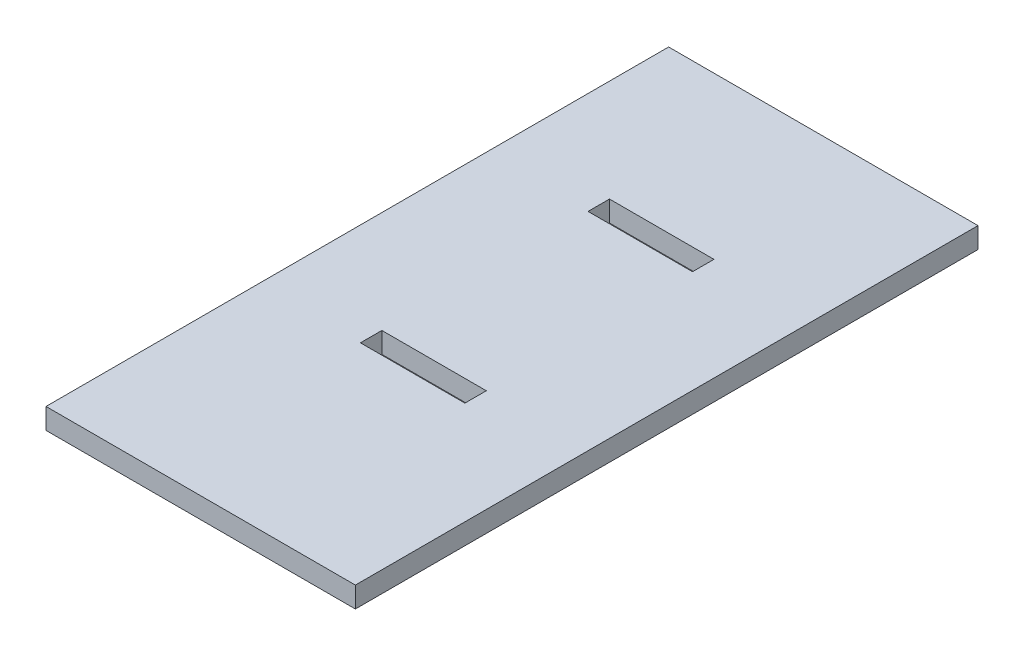
ISO-10303-21;
HEADER;
FILE_DESCRIPTION(('STEP AP214'),'2;1');
FILE_NAME('part.step','',(''),(''),'','','');
FILE_SCHEMA(('AUTOMOTIVE_DESIGN { 1 0 10303 214 1 1 1 1 }'));
ENDSEC;
DATA;
#1=APPLICATION_CONTEXT('core data for automotive mechanical design processes');
#2=APPLICATION_PROTOCOL_DEFINITION('international standard','automotive_design',2000,#1);
#3=PRODUCT_CONTEXT('',#1,'mechanical');
#4=PRODUCT('Part','Part','',(#3));
#5=PRODUCT_RELATED_PRODUCT_CATEGORY('part','',(#4));
#6=PRODUCT_DEFINITION_FORMATION('','',#4);
#7=PRODUCT_DEFINITION_CONTEXT('part definition',#1,'design');
#8=PRODUCT_DEFINITION('design','',#6,#7);
#9=PRODUCT_DEFINITION_SHAPE('','',#8);
#10=(LENGTH_UNIT() NAMED_UNIT(*) SI_UNIT(.MILLI.,.METRE.));
#11=(NAMED_UNIT(*) PLANE_ANGLE_UNIT() SI_UNIT($,.RADIAN.));
#12=(NAMED_UNIT(*) SI_UNIT($,.STERADIAN.) SOLID_ANGLE_UNIT());
#13=UNCERTAINTY_MEASURE_WITH_UNIT(LENGTH_MEASURE(1.E-05),#10,'distance_accuracy_value','');
#14=(GEOMETRIC_REPRESENTATION_CONTEXT(3) GLOBAL_UNCERTAINTY_ASSIGNED_CONTEXT((#13)) GLOBAL_UNIT_ASSIGNED_CONTEXT((#10,
#11,#12)) REPRESENTATION_CONTEXT('',''));
#15=CARTESIAN_POINT('',(0.,0.,0.));
#16=DIRECTION('',(0.,0.,1.));
#17=DIRECTION('',(1.,0.,0.));
#18=AXIS2_PLACEMENT_3D('',#15,#16,#17);
#19=CARTESIAN_POINT('',(0.,3.,0.));
#20=DIRECTION('',(0.,-1.,0.));
#21=DIRECTION('',(0.,0.,-1.));
#22=AXIS2_PLACEMENT_3D('',#19,#20,#21);
#23=PLANE('',#22);
#24=DIRECTION('',(0.,0.,1.));
#25=VECTOR('',#24,1.);
#26=CARTESIAN_POINT('',(14.76,3.,-33.79));
#27=LINE('',#26,#25);
#28=CARTESIAN_POINT('',(14.76,3.,-33.79));
#29=VERTEX_POINT('',#28);
#30=CARTESIAN_POINT('',(14.76,3.,-30.69));
#31=VERTEX_POINT('',#30);
#32=EDGE_CURVE('E164',#29,#31,#27,.T.);
#33=ORIENTED_EDGE('',*,*,#32,.F.);
#34=DIRECTION('',(-1.,0.,0.));
#35=VECTOR('',#34,1.);
#36=CARTESIAN_POINT('',(14.76,3.,-33.79));
#37=LINE('',#36,#35);
#38=CARTESIAN_POINT('',(29.86,3.,-33.79));
#39=VERTEX_POINT('',#38);
#40=EDGE_CURVE('E172',#39,#29,#37,.T.);
#41=ORIENTED_EDGE('',*,*,#40,.F.);
#42=DIRECTION('',(0.,0.,-1.));
#43=VECTOR('',#42,1.);
#44=CARTESIAN_POINT('',(29.86,3.,-33.79));
#45=LINE('',#44,#43);
#46=CARTESIAN_POINT('',(29.86,3.,-30.69));
#47=VERTEX_POINT('',#46);
#48=EDGE_CURVE('E169',#47,#39,#45,.T.);
#49=ORIENTED_EDGE('',*,*,#48,.F.);
#50=DIRECTION('',(1.,0.,0.));
#51=VECTOR('',#50,1.);
#52=CARTESIAN_POINT('',(14.76,3.,-30.69));
#53=LINE('',#52,#51);
#54=EDGE_CURVE('E166',#31,#47,#53,.T.);
#55=ORIENTED_EDGE('',*,*,#54,.F.);
#56=EDGE_LOOP('',(#33,#41,#49,#55));
#57=FACE_BOUND('',#56,.T.);
#58=DIRECTION('',(0.,0.,1.));
#59=VECTOR('',#58,1.);
#60=CARTESIAN_POINT('',(0.,3.,0.));
#61=LINE('',#60,#59);
#62=CARTESIAN_POINT('',(0.,3.,-90.));
#63=VERTEX_POINT('',#62);
#64=CARTESIAN_POINT('',(0.,3.,0.));
#65=VERTEX_POINT('',#64);
#66=EDGE_CURVE('E195',#63,#65,#61,.T.);
#67=ORIENTED_EDGE('',*,*,#66,.T.);
#68=DIRECTION('',(1.,0.,0.));
#69=VECTOR('',#68,1.);
#70=CARTESIAN_POINT('',(0.,3.,0.));
#71=LINE('',#70,#69);
#72=CARTESIAN_POINT('',(44.72,3.,0.));
#73=VERTEX_POINT('',#72);
#74=EDGE_CURVE('E198',#65,#73,#71,.T.);
#75=ORIENTED_EDGE('',*,*,#74,.T.);
#76=DIRECTION('',(0.,0.,-1.));
#77=VECTOR('',#76,1.);
#78=CARTESIAN_POINT('',(44.72,3.,0.));
#79=LINE('',#78,#77);
#80=CARTESIAN_POINT('',(44.72,3.,-90.));
#81=VERTEX_POINT('',#80);
#82=EDGE_CURVE('E201',#73,#81,#79,.T.);
#83=ORIENTED_EDGE('',*,*,#82,.T.);
#84=DIRECTION('',(-1.,0.,0.));
#85=VECTOR('',#84,1.);
#86=CARTESIAN_POINT('',(0.,3.,-90.));
#87=LINE('',#86,#85);
#88=EDGE_CURVE('E203',#81,#63,#87,.T.);
#89=ORIENTED_EDGE('',*,*,#88,.T.);
#90=EDGE_LOOP('',(#67,#75,#83,#89));
#91=FACE_BOUND('',#90,.T.);
#92=DIRECTION('',(0.,0.,1.));
#93=VECTOR('',#92,1.);
#94=CARTESIAN_POINT('',(14.76,3.,-66.69));
#95=LINE('',#94,#93);
#96=CARTESIAN_POINT('',(14.76,3.,-66.69));
#97=VERTEX_POINT('',#96);
#98=CARTESIAN_POINT('',(14.76,3.,-63.59));
#99=VERTEX_POINT('',#98);
#100=EDGE_CURVE('E128',#97,#99,#95,.T.);
#101=ORIENTED_EDGE('',*,*,#100,.F.);
#102=DIRECTION('',(-1.,0.,0.));
#103=VECTOR('',#102,1.);
#104=CARTESIAN_POINT('',(14.76,3.,-66.69));
#105=LINE('',#104,#103);
#106=CARTESIAN_POINT('',(29.86,3.,-66.69));
#107=VERTEX_POINT('',#106);
#108=EDGE_CURVE('E150',#107,#97,#105,.T.);
#109=ORIENTED_EDGE('',*,*,#108,.F.);
#110=DIRECTION('',(0.,0.,-1.));
#111=VECTOR('',#110,1.);
#112=CARTESIAN_POINT('',(29.86,3.,-66.69));
#113=LINE('',#112,#111);
#114=CARTESIAN_POINT('',(29.86,3.,-63.59));
#115=VERTEX_POINT('',#114);
#116=EDGE_CURVE('E148',#115,#107,#113,.T.);
#117=ORIENTED_EDGE('',*,*,#116,.F.);
#118=DIRECTION('',(1.,0.,0.));
#119=VECTOR('',#118,1.);
#120=CARTESIAN_POINT('',(14.76,3.,-63.59));
#121=LINE('',#120,#119);
#122=EDGE_CURVE('E136',#99,#115,#121,.T.);
#123=ORIENTED_EDGE('',*,*,#122,.F.);
#124=EDGE_LOOP('',(#101,#109,#117,#123));
#125=FACE_BOUND('',#124,.T.);
#126=ADVANCED_FACE('F39',(#57,#91,#125),#23,.F.);
#127=CARTESIAN_POINT('',(0.,0.,0.));
#128=DIRECTION('',(0.,-1.,0.));
#129=DIRECTION('',(0.,0.,-1.));
#130=AXIS2_PLACEMENT_3D('',#127,#128,#129);
#131=PLANE('',#130);
#132=DIRECTION('',(0.,0.,1.));
#133=VECTOR('',#132,1.);
#134=CARTESIAN_POINT('',(0.,0.,0.));
#135=LINE('',#134,#133);
#136=CARTESIAN_POINT('',(0.,0.,-90.));
#137=VERTEX_POINT('',#136);
#138=CARTESIAN_POINT('',(0.,0.,0.));
#139=VERTEX_POINT('',#138);
#140=EDGE_CURVE('E194',#137,#139,#135,.T.);
#141=ORIENTED_EDGE('',*,*,#140,.F.);
#142=DIRECTION('',(-1.,0.,0.));
#143=VECTOR('',#142,1.);
#144=CARTESIAN_POINT('',(0.,0.,-90.));
#145=LINE('',#144,#143);
#146=CARTESIAN_POINT('',(44.72,0.,-90.));
#147=VERTEX_POINT('',#146);
#148=EDGE_CURVE('E199',#147,#137,#145,.T.);
#149=ORIENTED_EDGE('',*,*,#148,.F.);
#150=DIRECTION('',(0.,0.,-1.));
#151=VECTOR('',#150,1.);
#152=CARTESIAN_POINT('',(44.72,0.,0.));
#153=LINE('',#152,#151);
#154=CARTESIAN_POINT('',(44.72,0.,0.));
#155=VERTEX_POINT('',#154);
#156=EDGE_CURVE('E210',#155,#147,#153,.T.);
#157=ORIENTED_EDGE('',*,*,#156,.F.);
#158=DIRECTION('',(1.,0.,0.));
#159=VECTOR('',#158,1.);
#160=CARTESIAN_POINT('',(0.,0.,0.));
#161=LINE('',#160,#159);
#162=EDGE_CURVE('E208',#139,#155,#161,.T.);
#163=ORIENTED_EDGE('',*,*,#162,.F.);
#164=EDGE_LOOP('',(#141,#149,#157,#163));
#165=FACE_BOUND('',#164,.T.);
#166=DIRECTION('',(-1.,0.,0.));
#167=VECTOR('',#166,1.);
#168=CARTESIAN_POINT('',(14.76,0.,-33.79));
#169=LINE('',#168,#167);
#170=CARTESIAN_POINT('',(29.86,0.,-33.79));
#171=VERTEX_POINT('',#170);
#172=CARTESIAN_POINT('',(14.76,0.,-33.79));
#173=VERTEX_POINT('',#172);
#174=EDGE_CURVE('E167',#171,#173,#169,.T.);
#175=ORIENTED_EDGE('',*,*,#174,.T.);
#176=DIRECTION('',(0.,0.,1.));
#177=VECTOR('',#176,1.);
#178=CARTESIAN_POINT('',(14.76,0.,-33.79));
#179=LINE('',#178,#177);
#180=CARTESIAN_POINT('',(14.76,0.,-30.69));
#181=VERTEX_POINT('',#180);
#182=EDGE_CURVE('E144',#173,#181,#179,.T.);
#183=ORIENTED_EDGE('',*,*,#182,.T.);
#184=DIRECTION('',(1.,0.,0.));
#185=VECTOR('',#184,1.);
#186=CARTESIAN_POINT('',(14.76,0.,-30.69));
#187=LINE('',#186,#185);
#188=CARTESIAN_POINT('',(29.86,0.,-30.69));
#189=VERTEX_POINT('',#188);
#190=EDGE_CURVE('E177',#181,#189,#187,.T.);
#191=ORIENTED_EDGE('',*,*,#190,.T.);
#192=DIRECTION('',(0.,0.,-1.));
#193=VECTOR('',#192,1.);
#194=CARTESIAN_POINT('',(29.86,0.,-33.79));
#195=LINE('',#194,#193);
#196=EDGE_CURVE('E180',#189,#171,#195,.T.);
#197=ORIENTED_EDGE('',*,*,#196,.T.);
#198=EDGE_LOOP('',(#175,#183,#191,#197));
#199=FACE_BOUND('',#198,.T.);
#200=DIRECTION('',(-1.,0.,0.));
#201=VECTOR('',#200,1.);
#202=CARTESIAN_POINT('',(14.76,0.,-66.69));
#203=LINE('',#202,#201);
#204=CARTESIAN_POINT('',(29.86,0.,-66.69));
#205=VERTEX_POINT('',#204);
#206=CARTESIAN_POINT('',(14.76,0.,-66.69));
#207=VERTEX_POINT('',#206);
#208=EDGE_CURVE('E137',#205,#207,#203,.T.);
#209=ORIENTED_EDGE('',*,*,#208,.T.);
#210=DIRECTION('',(0.,0.,1.));
#211=VECTOR('',#210,1.);
#212=CARTESIAN_POINT('',(14.76,0.,-66.69));
#213=LINE('',#212,#211);
#214=CARTESIAN_POINT('',(14.76,0.,-63.59));
#215=VERTEX_POINT('',#214);
#216=EDGE_CURVE('E62',#207,#215,#213,.T.);
#217=ORIENTED_EDGE('',*,*,#216,.T.);
#218=DIRECTION('',(1.,0.,0.));
#219=VECTOR('',#218,1.);
#220=CARTESIAN_POINT('',(14.76,0.,-63.59));
#221=LINE('',#220,#219);
#222=CARTESIAN_POINT('',(29.86,0.,-63.59));
#223=VERTEX_POINT('',#222);
#224=EDGE_CURVE('E143',#215,#223,#221,.T.);
#225=ORIENTED_EDGE('',*,*,#224,.T.);
#226=DIRECTION('',(0.,0.,-1.));
#227=VECTOR('',#226,1.);
#228=CARTESIAN_POINT('',(29.86,0.,-66.69));
#229=LINE('',#228,#227);
#230=EDGE_CURVE('E156',#223,#205,#229,.T.);
#231=ORIENTED_EDGE('',*,*,#230,.T.);
#232=EDGE_LOOP('',(#209,#217,#225,#231));
#233=FACE_BOUND('',#232,.T.);
#234=ADVANCED_FACE('F228',(#165,#199,#233),#131,.T.);
#235=CARTESIAN_POINT('',(0.,3.,0.));
#236=DIRECTION('',(1.,0.,0.));
#237=DIRECTION('',(0.,0.,-1.));
#238=AXIS2_PLACEMENT_3D('',#235,#236,#237);
#239=PLANE('',#238);
#240=ORIENTED_EDGE('',*,*,#140,.T.);
#241=DIRECTION('',(0.,-1.,0.));
#242=VECTOR('',#241,1.);
#243=CARTESIAN_POINT('',(0.,3.,0.));
#244=LINE('',#243,#242);
#245=EDGE_CURVE('E11',#65,#139,#244,.T.);
#246=ORIENTED_EDGE('',*,*,#245,.F.);
#247=ORIENTED_EDGE('',*,*,#66,.F.);
#248=DIRECTION('',(0.,-1.,0.));
#249=VECTOR('',#248,1.);
#250=CARTESIAN_POINT('',(0.,3.,-90.));
#251=LINE('',#250,#249);
#252=EDGE_CURVE('E205',#63,#137,#251,.T.);
#253=ORIENTED_EDGE('',*,*,#252,.T.);
#254=EDGE_LOOP('',(#240,#246,#247,#253));
#255=FACE_BOUND('',#254,.T.);
#256=ADVANCED_FACE('F41',(#255),#239,.F.);
#257=CARTESIAN_POINT('',(0.,3.,0.));
#258=DIRECTION('',(0.,0.,-1.));
#259=DIRECTION('',(-1.,0.,0.));
#260=AXIS2_PLACEMENT_3D('',#257,#258,#259);
#261=PLANE('',#260);
#262=ORIENTED_EDGE('',*,*,#162,.T.);
#263=DIRECTION('',(0.,-1.,0.));
#264=VECTOR('',#263,1.);
#265=CARTESIAN_POINT('',(44.72,3.,0.));
#266=LINE('',#265,#264);
#267=EDGE_CURVE('E47',#73,#155,#266,.T.);
#268=ORIENTED_EDGE('',*,*,#267,.F.);
#269=ORIENTED_EDGE('',*,*,#74,.F.);
#270=ORIENTED_EDGE('',*,*,#245,.T.);
#271=EDGE_LOOP('',(#262,#268,#269,#270));
#272=FACE_BOUND('',#271,.T.);
#273=ADVANCED_FACE('F238',(#272),#261,.F.);
#274=CARTESIAN_POINT('',(44.72,3.,0.));
#275=DIRECTION('',(-1.,0.,0.));
#276=DIRECTION('',(0.,0.,1.));
#277=AXIS2_PLACEMENT_3D('',#274,#275,#276);
#278=PLANE('',#277);
#279=ORIENTED_EDGE('',*,*,#156,.T.);
#280=DIRECTION('',(0.,-1.,0.));
#281=VECTOR('',#280,1.);
#282=CARTESIAN_POINT('',(44.72,3.,-90.));
#283=LINE('',#282,#281);
#284=EDGE_CURVE('E215',#81,#147,#283,.T.);
#285=ORIENTED_EDGE('',*,*,#284,.F.);
#286=ORIENTED_EDGE('',*,*,#82,.F.);
#287=ORIENTED_EDGE('',*,*,#267,.T.);
#288=EDGE_LOOP('',(#279,#285,#286,#287));
#289=FACE_BOUND('',#288,.T.);
#290=ADVANCED_FACE('F222',(#289),#278,.F.);
#291=CARTESIAN_POINT('',(0.,3.,-90.));
#292=DIRECTION('',(0.,0.,1.));
#293=DIRECTION('',(1.,0.,0.));
#294=AXIS2_PLACEMENT_3D('',#291,#292,#293);
#295=PLANE('',#294);
#296=ORIENTED_EDGE('',*,*,#148,.T.);
#297=ORIENTED_EDGE('',*,*,#252,.F.);
#298=ORIENTED_EDGE('',*,*,#88,.F.);
#299=ORIENTED_EDGE('',*,*,#284,.T.);
#300=EDGE_LOOP('',(#296,#297,#298,#299));
#301=FACE_BOUND('',#300,.T.);
#302=ADVANCED_FACE('F232',(#301),#295,.F.);
#303=CARTESIAN_POINT('',(14.76,3.,-33.79));
#304=DIRECTION('',(1.,0.,0.));
#305=DIRECTION('',(0.,0.,-1.));
#306=AXIS2_PLACEMENT_3D('',#303,#304,#305);
#307=PLANE('',#306);
#308=ORIENTED_EDGE('',*,*,#182,.F.);
#309=DIRECTION('',(0.,-1.,0.));
#310=VECTOR('',#309,1.);
#311=CARTESIAN_POINT('',(14.76,3.,-33.79));
#312=LINE('',#311,#310);
#313=EDGE_CURVE('E174',#29,#173,#312,.T.);
#314=ORIENTED_EDGE('',*,*,#313,.F.);
#315=ORIENTED_EDGE('',*,*,#32,.T.);
#316=DIRECTION('',(0.,-1.,0.));
#317=VECTOR('',#316,1.);
#318=CARTESIAN_POINT('',(14.76,3.,-30.69));
#319=LINE('',#318,#317);
#320=EDGE_CURVE('E191',#31,#181,#319,.T.);
#321=ORIENTED_EDGE('',*,*,#320,.T.);
#322=EDGE_LOOP('',(#308,#314,#315,#321));
#323=FACE_BOUND('',#322,.T.);
#324=ADVANCED_FACE('F254',(#323),#307,.T.);
#325=CARTESIAN_POINT('',(14.76,3.,-30.69));
#326=DIRECTION('',(0.,0.,-1.));
#327=DIRECTION('',(-1.,0.,0.));
#328=AXIS2_PLACEMENT_3D('',#325,#326,#327);
#329=PLANE('',#328);
#330=ORIENTED_EDGE('',*,*,#190,.F.);
#331=ORIENTED_EDGE('',*,*,#320,.F.);
#332=ORIENTED_EDGE('',*,*,#54,.T.);
#333=DIRECTION('',(0.,-1.,0.));
#334=VECTOR('',#333,1.);
#335=CARTESIAN_POINT('',(29.86,3.,-30.69));
#336=LINE('',#335,#334);
#337=EDGE_CURVE('E189',#47,#189,#336,.T.);
#338=ORIENTED_EDGE('',*,*,#337,.T.);
#339=EDGE_LOOP('',(#330,#331,#332,#338));
#340=FACE_BOUND('',#339,.T.);
#341=ADVANCED_FACE('F261',(#340),#329,.T.);
#342=CARTESIAN_POINT('',(29.86,3.,-33.79));
#343=DIRECTION('',(-1.,0.,0.));
#344=DIRECTION('',(0.,0.,1.));
#345=AXIS2_PLACEMENT_3D('',#342,#343,#344);
#346=PLANE('',#345);
#347=ORIENTED_EDGE('',*,*,#196,.F.);
#348=ORIENTED_EDGE('',*,*,#337,.F.);
#349=ORIENTED_EDGE('',*,*,#48,.T.);
#350=DIRECTION('',(0.,-1.,0.));
#351=VECTOR('',#350,1.);
#352=CARTESIAN_POINT('',(29.86,3.,-33.79));
#353=LINE('',#352,#351);
#354=EDGE_CURVE('E187',#39,#171,#353,.T.);
#355=ORIENTED_EDGE('',*,*,#354,.T.);
#356=EDGE_LOOP('',(#347,#348,#349,#355));
#357=FACE_BOUND('',#356,.T.);
#358=ADVANCED_FACE('F266',(#357),#346,.T.);
#359=CARTESIAN_POINT('',(14.76,3.,-33.79));
#360=DIRECTION('',(0.,0.,1.));
#361=DIRECTION('',(1.,0.,0.));
#362=AXIS2_PLACEMENT_3D('',#359,#360,#361);
#363=PLANE('',#362);
#364=ORIENTED_EDGE('',*,*,#174,.F.);
#365=ORIENTED_EDGE('',*,*,#354,.F.);
#366=ORIENTED_EDGE('',*,*,#40,.T.);
#367=ORIENTED_EDGE('',*,*,#313,.T.);
#368=EDGE_LOOP('',(#364,#365,#366,#367));
#369=FACE_BOUND('',#368,.T.);
#370=ADVANCED_FACE('F272',(#369),#363,.T.);
#371=CARTESIAN_POINT('',(14.76,3.,-66.69));
#372=DIRECTION('',(1.,0.,0.));
#373=DIRECTION('',(0.,0.,-1.));
#374=AXIS2_PLACEMENT_3D('',#371,#372,#373);
#375=PLANE('',#374);
#376=ORIENTED_EDGE('',*,*,#216,.F.);
#377=DIRECTION('',(0.,-1.,0.));
#378=VECTOR('',#377,1.);
#379=CARTESIAN_POINT('',(14.76,3.,-66.69));
#380=LINE('',#379,#378);
#381=EDGE_CURVE('E132',#97,#207,#380,.T.);
#382=ORIENTED_EDGE('',*,*,#381,.F.);
#383=ORIENTED_EDGE('',*,*,#100,.T.);
#384=DIRECTION('',(0.,-1.,0.));
#385=VECTOR('',#384,1.);
#386=CARTESIAN_POINT('',(14.76,3.,-63.59));
#387=LINE('',#386,#385);
#388=EDGE_CURVE('E131',#99,#215,#387,.T.);
#389=ORIENTED_EDGE('',*,*,#388,.T.);
#390=EDGE_LOOP('',(#376,#382,#383,#389));
#391=FACE_BOUND('',#390,.T.);
#392=ADVANCED_FACE('F130',(#391),#375,.T.);
#393=CARTESIAN_POINT('',(14.76,3.,-63.59));
#394=DIRECTION('',(0.,0.,-1.));
#395=DIRECTION('',(-1.,0.,0.));
#396=AXIS2_PLACEMENT_3D('',#393,#394,#395);
#397=PLANE('',#396);
#398=ORIENTED_EDGE('',*,*,#224,.F.);
#399=ORIENTED_EDGE('',*,*,#388,.F.);
#400=ORIENTED_EDGE('',*,*,#122,.T.);
#401=DIRECTION('',(0.,-1.,0.));
#402=VECTOR('',#401,1.);
#403=CARTESIAN_POINT('',(29.86,3.,-63.59));
#404=LINE('',#403,#402);
#405=EDGE_CURVE('E145',#115,#223,#404,.T.);
#406=ORIENTED_EDGE('',*,*,#405,.T.);
#407=EDGE_LOOP('',(#398,#399,#400,#406));
#408=FACE_BOUND('',#407,.T.);
#409=ADVANCED_FACE('F140',(#408),#397,.T.);
#410=CARTESIAN_POINT('',(29.86,3.,-66.69));
#411=DIRECTION('',(-1.,0.,0.));
#412=DIRECTION('',(0.,0.,1.));
#413=AXIS2_PLACEMENT_3D('',#410,#411,#412);
#414=PLANE('',#413);
#415=ORIENTED_EDGE('',*,*,#230,.F.);
#416=ORIENTED_EDGE('',*,*,#405,.F.);
#417=ORIENTED_EDGE('',*,*,#116,.T.);
#418=DIRECTION('',(0.,-1.,0.));
#419=VECTOR('',#418,1.);
#420=CARTESIAN_POINT('',(29.86,3.,-66.69));
#421=LINE('',#420,#419);
#422=EDGE_CURVE('E54',#107,#205,#421,.T.);
#423=ORIENTED_EDGE('',*,*,#422,.T.);
#424=EDGE_LOOP('',(#415,#416,#417,#423));
#425=FACE_BOUND('',#424,.T.);
#426=ADVANCED_FACE('F291',(#425),#414,.T.);
#427=CARTESIAN_POINT('',(14.76,3.,-66.69));
#428=DIRECTION('',(0.,0.,1.));
#429=DIRECTION('',(1.,0.,0.));
#430=AXIS2_PLACEMENT_3D('',#427,#428,#429);
#431=PLANE('',#430);
#432=ORIENTED_EDGE('',*,*,#208,.F.);
#433=ORIENTED_EDGE('',*,*,#422,.F.);
#434=ORIENTED_EDGE('',*,*,#108,.T.);
#435=ORIENTED_EDGE('',*,*,#381,.T.);
#436=EDGE_LOOP('',(#432,#433,#434,#435));
#437=FACE_BOUND('',#436,.T.);
#438=ADVANCED_FACE('F294',(#437),#431,.T.);
#439=CLOSED_SHELL('',(#126,#234,#256,#273,#290,#302,#324,#341,#358,#370,#392,#409,#426,#438));
#440=MANIFOLD_SOLID_BREP('B2',#439);
#441=ADVANCED_BREP_SHAPE_REPRESENTATION('',(#18,#440),#14);
#442=SHAPE_DEFINITION_REPRESENTATION(#9,#441);
ENDSEC;
END-ISO-10303-21;
